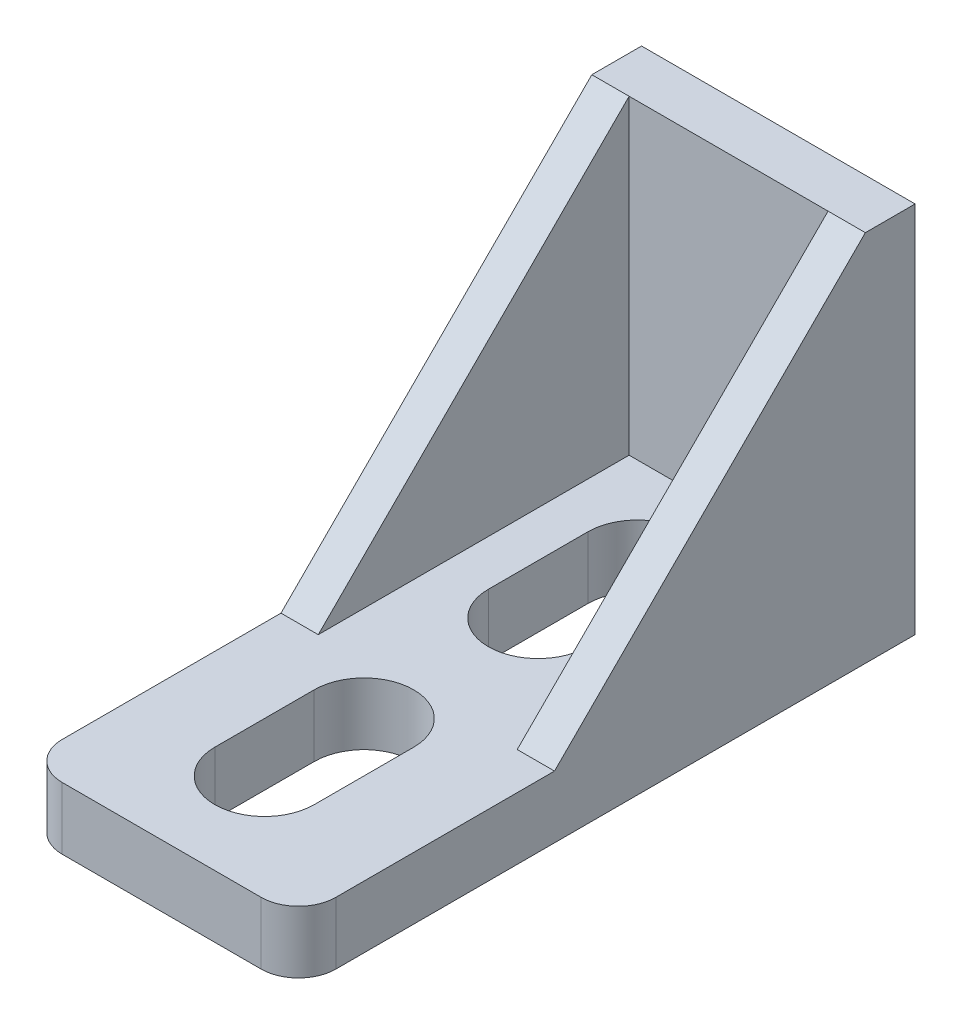
ISO-10303-21;
HEADER;
FILE_DESCRIPTION(('STEP AP214'),'2;1');
FILE_NAME('part.step','',(''),(''),'','','');
FILE_SCHEMA(('AUTOMOTIVE_DESIGN { 1 0 10303 214 1 1 1 1 }'));
ENDSEC;
DATA;
#1=APPLICATION_CONTEXT('core data for automotive mechanical design processes');
#2=APPLICATION_PROTOCOL_DEFINITION('international standard','automotive_design',2000,#1);
#3=PRODUCT_CONTEXT('',#1,'mechanical');
#4=PRODUCT('Part','Part','',(#3));
#5=PRODUCT_RELATED_PRODUCT_CATEGORY('part','',(#4));
#6=PRODUCT_DEFINITION_FORMATION('','',#4);
#7=PRODUCT_DEFINITION_CONTEXT('part definition',#1,'design');
#8=PRODUCT_DEFINITION('design','',#6,#7);
#9=PRODUCT_DEFINITION_SHAPE('','',#8);
#10=(LENGTH_UNIT() NAMED_UNIT(*) SI_UNIT(.MILLI.,.METRE.));
#11=(NAMED_UNIT(*) PLANE_ANGLE_UNIT() SI_UNIT($,.RADIAN.));
#12=(NAMED_UNIT(*) SI_UNIT($,.STERADIAN.) SOLID_ANGLE_UNIT());
#13=UNCERTAINTY_MEASURE_WITH_UNIT(LENGTH_MEASURE(1.E-05),#10,'distance_accuracy_value','');
#14=(GEOMETRIC_REPRESENTATION_CONTEXT(3) GLOBAL_UNCERTAINTY_ASSIGNED_CONTEXT((#13)) GLOBAL_UNIT_ASSIGNED_CONTEXT((#10,
#11,#12)) REPRESENTATION_CONTEXT('',''));
#15=CARTESIAN_POINT('',(0.,0.,0.));
#16=DIRECTION('',(0.,0.,1.));
#17=DIRECTION('',(1.,0.,0.));
#18=AXIS2_PLACEMENT_3D('',#15,#16,#17);
#19=CARTESIAN_POINT('',(-10.7237920302694,30.,-10.2796208530806));
#20=DIRECTION('',(0.,0.,-1.));
#21=DIRECTION('',(-1.,0.,0.));
#22=AXIS2_PLACEMENT_3D('',#19,#20,#21);
#23=PLANE('',#22);
#24=DIRECTION('',(0.,1.,0.));
#25=VECTOR('',#24,1.);
#26=CARTESIAN_POINT('',(8.27620796973059,5.,-10.2796208530806));
#27=LINE('',#26,#25);
#28=CARTESIAN_POINT('',(8.27620796973059,5.,-10.2796208530806));
#29=VERTEX_POINT('',#28);
#30=CARTESIAN_POINT('',(8.27620796973059,30.,-10.2796208530806));
#31=VERTEX_POINT('',#30);
#32=EDGE_CURVE('E173',#29,#31,#27,.T.);
#33=ORIENTED_EDGE('',*,*,#32,.T.);
#34=DIRECTION('',(1.,0.,0.));
#35=VECTOR('',#34,1.);
#36=CARTESIAN_POINT('',(-10.7237920302694,30.,-10.2796208530806));
#37=LINE('',#36,#35);
#38=CARTESIAN_POINT('',(-7.72379203026941,30.,-10.2796208530806));
#39=VERTEX_POINT('',#38);
#40=EDGE_CURVE('E211',#39,#31,#37,.T.);
#41=ORIENTED_EDGE('',*,*,#40,.F.);
#42=DIRECTION('',(0.,1.,0.));
#43=VECTOR('',#42,1.);
#44=CARTESIAN_POINT('',(-7.72379203026941,5.00000000000001,-10.2796208530806));
#45=LINE('',#44,#43);
#46=CARTESIAN_POINT('',(-7.72379203026941,5.,-10.2796208530806));
#47=VERTEX_POINT('',#46);
#48=EDGE_CURVE('E201',#47,#39,#45,.T.);
#49=ORIENTED_EDGE('',*,*,#48,.F.);
#50=DIRECTION('',(1.,0.,0.));
#51=VECTOR('',#50,1.);
#52=CARTESIAN_POINT('',(0.,5.,-10.2796208530806));
#53=LINE('',#52,#51);
#54=EDGE_CURVE('E221',#47,#29,#53,.T.);
#55=ORIENTED_EDGE('',*,*,#54,.T.);
#56=EDGE_LOOP('',(#33,#41,#49,#55));
#57=FACE_BOUND('',#56,.T.);
#58=ADVANCED_FACE('F35',(#57),#23,.F.);
#59=CARTESIAN_POINT('',(0.,5.,0.));
#60=DIRECTION('',(0.,-1.,0.));
#61=DIRECTION('',(0.,0.,-1.));
#62=AXIS2_PLACEMENT_3D('',#59,#60,#61);
#63=PLANE('',#62);
#64=CARTESIAN_POINT('',(-0.048192250806987,5.,4.72037914691943));
#65=DIRECTION('',(0.,1.,0.));
#66=DIRECTION('',(0.,0.,1.));
#67=AXIS2_PLACEMENT_3D('',#64,#65,#66);
#68=CIRCLE('',#67,4.);
#69=CARTESIAN_POINT('',(-4.04819225080699,5.,4.72037914691943));
#70=VERTEX_POINT('',#69);
#71=CARTESIAN_POINT('',(3.95180774919301,5.,4.72037914691943));
#72=VERTEX_POINT('',#71);
#73=EDGE_CURVE('E255',#70,#72,#68,.T.);
#74=ORIENTED_EDGE('',*,*,#73,.F.);
#75=DIRECTION('',(0.,0.,1.));
#76=VECTOR('',#75,1.);
#77=CARTESIAN_POINT('',(-4.04819225080699,5.,4.72037914691943));
#78=LINE('',#77,#76);
#79=CARTESIAN_POINT('',(-4.04819225080699,5.,-3.27962085308057));
#80=VERTEX_POINT('',#79);
#81=EDGE_CURVE('E263',#80,#70,#78,.T.);
#82=ORIENTED_EDGE('',*,*,#81,.F.);
#83=CARTESIAN_POINT('',(-0.0481922508069871,5.,-3.27962085308057));
#84=DIRECTION('',(0.,1.,0.));
#85=DIRECTION('',(0.,0.,-1.));
#86=AXIS2_PLACEMENT_3D('',#83,#84,#85);
#87=CIRCLE('',#86,4.);
#88=CARTESIAN_POINT('',(3.95180774919301,5.,-3.27962085308057));
#89=VERTEX_POINT('',#88);
#90=EDGE_CURVE('E260',#89,#80,#87,.T.);
#91=ORIENTED_EDGE('',*,*,#90,.F.);
#92=DIRECTION('',(0.,0.,-1.));
#93=VECTOR('',#92,1.);
#94=CARTESIAN_POINT('',(3.95180774919301,5.,4.72037914691943));
#95=LINE('',#94,#93);
#96=EDGE_CURVE('E257',#72,#89,#95,.T.);
#97=ORIENTED_EDGE('',*,*,#96,.F.);
#98=EDGE_LOOP('',(#74,#82,#91,#97));
#99=FACE_BOUND('',#98,.T.);
#100=CARTESIAN_POINT('',(-0.048192250806987,5.,26.7203791469194));
#101=DIRECTION('',(0.,1.,0.));
#102=DIRECTION('',(0.,0.,1.));
#103=AXIS2_PLACEMENT_3D('',#100,#101,#102);
#104=CIRCLE('',#103,4.);
#105=CARTESIAN_POINT('',(-4.04819225080699,5.,26.7203791469194));
#106=VERTEX_POINT('',#105);
#107=CARTESIAN_POINT('',(3.95180774919301,5.,26.7203791469194));
#108=VERTEX_POINT('',#107);
#109=EDGE_CURVE('E224',#106,#108,#104,.T.);
#110=ORIENTED_EDGE('',*,*,#109,.F.);
#111=DIRECTION('',(0.,0.,1.));
#112=VECTOR('',#111,1.);
#113=CARTESIAN_POINT('',(-4.04819225080699,5.,26.7203791469194));
#114=LINE('',#113,#112);
#115=CARTESIAN_POINT('',(-4.04819225080699,5.,18.7203791469194));
#116=VERTEX_POINT('',#115);
#117=EDGE_CURVE('E232',#116,#106,#114,.T.);
#118=ORIENTED_EDGE('',*,*,#117,.F.);
#119=CARTESIAN_POINT('',(-0.048192250806987,5.,18.7203791469194));
#120=DIRECTION('',(0.,1.,0.));
#121=DIRECTION('',(0.,0.,-1.));
#122=AXIS2_PLACEMENT_3D('',#119,#120,#121);
#123=CIRCLE('',#122,4.);
#124=CARTESIAN_POINT('',(3.95180774919301,5.,18.7203791469194));
#125=VERTEX_POINT('',#124);
#126=EDGE_CURVE('E229',#125,#116,#123,.T.);
#127=ORIENTED_EDGE('',*,*,#126,.F.);
#128=DIRECTION('',(0.,0.,-1.));
#129=VECTOR('',#128,1.);
#130=CARTESIAN_POINT('',(3.95180774919301,5.,26.7203791469194));
#131=LINE('',#130,#129);
#132=EDGE_CURVE('E226',#108,#125,#131,.T.);
#133=ORIENTED_EDGE('',*,*,#132,.F.);
#134=EDGE_LOOP('',(#110,#118,#127,#133));
#135=FACE_BOUND('',#134,.T.);
#136=DIRECTION('',(1.,0.,0.));
#137=VECTOR('',#136,1.);
#138=CARTESIAN_POINT('',(11.2762079697306,5.,35.3102157116609));
#139=LINE('',#138,#137);
#140=CARTESIAN_POINT('',(-7.72379203026941,5.,35.3102157116609));
#141=VERTEX_POINT('',#140);
#142=CARTESIAN_POINT('',(8.27620796973059,5.,35.3102157116609));
#143=VERTEX_POINT('',#142);
#144=EDGE_CURVE('E288',#141,#143,#139,.T.);
#145=ORIENTED_EDGE('',*,*,#144,.T.);
#146=CARTESIAN_POINT('',(8.27620796973059,5.,32.3102157116609));
#147=DIRECTION('',(0.,-1.,0.));
#148=DIRECTION('',(0.,0.,-1.));
#149=AXIS2_PLACEMENT_3D('',#146,#147,#148);
#150=CIRCLE('',#149,3.);
#151=CARTESIAN_POINT('',(11.2762079697306,5.,32.3102157116609));
#152=VERTEX_POINT('',#151);
#153=EDGE_CURVE('E43',#143,#152,#150,.F.);
#154=ORIENTED_EDGE('',*,*,#153,.T.);
#155=DIRECTION('',(0.,0.,-1.));
#156=VECTOR('',#155,1.);
#157=CARTESIAN_POINT('',(11.2762079697306,5.,-14.2796208530806));
#158=LINE('',#157,#156);
#159=CARTESIAN_POINT('',(11.2762079697306,5.,14.7203791469194));
#160=VERTEX_POINT('',#159);
#161=EDGE_CURVE('E190',#152,#160,#158,.T.);
#162=ORIENTED_EDGE('',*,*,#161,.T.);
#163=DIRECTION('',(1.,0.,0.));
#164=VECTOR('',#163,1.);
#165=CARTESIAN_POINT('',(8.27620796973059,5.,14.7203791469194));
#166=LINE('',#165,#164);
#167=CARTESIAN_POINT('',(8.27620796973059,5.,14.7203791469194));
#168=VERTEX_POINT('',#167);
#169=EDGE_CURVE('E182',#168,#160,#166,.T.);
#170=ORIENTED_EDGE('',*,*,#169,.F.);
#171=DIRECTION('',(0.,0.,-1.));
#172=VECTOR('',#171,1.);
#173=CARTESIAN_POINT('',(8.27620796973059,5.,-14.2796208530806));
#174=LINE('',#173,#172);
#175=EDGE_CURVE('E168',#168,#29,#174,.T.);
#176=ORIENTED_EDGE('',*,*,#175,.T.);
#177=ORIENTED_EDGE('',*,*,#54,.F.);
#178=DIRECTION('',(0.,0.,-1.));
#179=VECTOR('',#178,1.);
#180=CARTESIAN_POINT('',(-7.72379203026941,5.,35.3102157116609));
#181=LINE('',#180,#179);
#182=CARTESIAN_POINT('',(-7.72379203026941,5.,14.7203791469194));
#183=VERTEX_POINT('',#182);
#184=EDGE_CURVE('E199',#183,#47,#181,.T.);
#185=ORIENTED_EDGE('',*,*,#184,.F.);
#186=DIRECTION('',(-1.,0.,0.));
#187=VECTOR('',#186,1.);
#188=CARTESIAN_POINT('',(-7.72379203026941,5.,14.7203791469194));
#189=LINE('',#188,#187);
#190=CARTESIAN_POINT('',(-10.7237920302694,5.,14.7203791469194));
#191=VERTEX_POINT('',#190);
#192=EDGE_CURVE('E204',#183,#191,#189,.T.);
#193=ORIENTED_EDGE('',*,*,#192,.T.);
#194=DIRECTION('',(0.,0.,1.));
#195=VECTOR('',#194,1.);
#196=CARTESIAN_POINT('',(-10.7237920302694,5.,35.3102157116609));
#197=LINE('',#196,#195);
#198=CARTESIAN_POINT('',(-10.7237920302694,5.,32.3102157116609));
#199=VERTEX_POINT('',#198);
#200=EDGE_CURVE('E286',#191,#199,#197,.T.);
#201=ORIENTED_EDGE('',*,*,#200,.T.);
#202=CARTESIAN_POINT('',(-7.72379203026941,5.,32.3102157116609));
#203=DIRECTION('',(0.,-1.,0.));
#204=DIRECTION('',(0.,0.,-1.));
#205=AXIS2_PLACEMENT_3D('',#202,#203,#204);
#206=CIRCLE('',#205,3.);
#207=EDGE_CURVE('E315',#199,#141,#206,.F.);
#208=ORIENTED_EDGE('',*,*,#207,.T.);
#209=EDGE_LOOP('',(#145,#154,#162,#170,#176,#177,#185,#193,#201,#208));
#210=FACE_BOUND('',#209,.T.);
#211=ADVANCED_FACE('F188',(#99,#135,#210),#63,.F.);
#212=CARTESIAN_POINT('',(0.,0.,0.));
#213=DIRECTION('',(0.,-1.,0.));
#214=DIRECTION('',(0.,0.,-1.));
#215=AXIS2_PLACEMENT_3D('',#212,#213,#214);
#216=PLANE('',#215);
#217=DIRECTION('',(0.,0.,-1.));
#218=VECTOR('',#217,1.);
#219=CARTESIAN_POINT('',(11.2762079697306,0.,-14.2796208530806));
#220=LINE('',#219,#218);
#221=CARTESIAN_POINT('',(11.2762079697306,0.,32.3102157116609));
#222=VERTEX_POINT('',#221);
#223=CARTESIAN_POINT('',(11.2762079697306,0.,-14.2796208530806));
#224=VERTEX_POINT('',#223);
#225=EDGE_CURVE('E296',#222,#224,#220,.T.);
#226=ORIENTED_EDGE('',*,*,#225,.F.);
#227=CARTESIAN_POINT('',(8.27620796973059,0.,32.3102157116609));
#228=DIRECTION('',(0.,-1.,0.));
#229=DIRECTION('',(0.,0.,-1.));
#230=AXIS2_PLACEMENT_3D('',#227,#228,#229);
#231=CIRCLE('',#230,3.);
#232=CARTESIAN_POINT('',(8.27620796973059,0.,35.3102157116609));
#233=VERTEX_POINT('',#232);
#234=EDGE_CURVE('E309',#222,#233,#231,.T.);
#235=ORIENTED_EDGE('',*,*,#234,.T.);
#236=DIRECTION('',(1.,0.,0.));
#237=VECTOR('',#236,1.);
#238=CARTESIAN_POINT('',(11.2762079697306,0.,35.3102157116609));
#239=LINE('',#238,#237);
#240=CARTESIAN_POINT('',(-7.72379203026941,0.,35.3102157116609));
#241=VERTEX_POINT('',#240);
#242=EDGE_CURVE('E294',#241,#233,#239,.T.);
#243=ORIENTED_EDGE('',*,*,#242,.F.);
#244=CARTESIAN_POINT('',(-7.72379203026941,0.,32.3102157116609));
#245=DIRECTION('',(0.,-1.,0.));
#246=DIRECTION('',(0.,0.,-1.));
#247=AXIS2_PLACEMENT_3D('',#244,#245,#246);
#248=CIRCLE('',#247,3.);
#249=CARTESIAN_POINT('',(-10.7237920302694,0.,32.3102157116609));
#250=VERTEX_POINT('',#249);
#251=EDGE_CURVE('E307',#241,#250,#248,.T.);
#252=ORIENTED_EDGE('',*,*,#251,.T.);
#253=DIRECTION('',(0.,0.,1.));
#254=VECTOR('',#253,1.);
#255=CARTESIAN_POINT('',(-10.7237920302694,0.,35.3102157116609));
#256=LINE('',#255,#254);
#257=CARTESIAN_POINT('',(-10.7237920302694,0.,-14.2796208530806));
#258=VERTEX_POINT('',#257);
#259=EDGE_CURVE('E285',#258,#250,#256,.T.);
#260=ORIENTED_EDGE('',*,*,#259,.F.);
#261=DIRECTION('',(-1.,0.,0.));
#262=VECTOR('',#261,1.);
#263=CARTESIAN_POINT('',(0.276207969730589,0.,-14.2796208530806));
#264=LINE('',#263,#262);
#265=EDGE_CURVE('E289',#224,#258,#264,.T.);
#266=ORIENTED_EDGE('',*,*,#265,.F.);
#267=EDGE_LOOP('',(#226,#235,#243,#252,#260,#266));
#268=FACE_BOUND('',#267,.T.);
#269=DIRECTION('',(0.,0.,1.));
#270=VECTOR('',#269,1.);
#271=CARTESIAN_POINT('',(-4.04819225080699,0.,4.72037914691943));
#272=LINE('',#271,#270);
#273=CARTESIAN_POINT('',(-4.04819225080699,0.,-3.27962085308057));
#274=VERTEX_POINT('',#273);
#275=CARTESIAN_POINT('',(-4.04819225080699,0.,4.72037914691943));
#276=VERTEX_POINT('',#275);
#277=EDGE_CURVE('E258',#274,#276,#272,.T.);
#278=ORIENTED_EDGE('',*,*,#277,.T.);
#279=CARTESIAN_POINT('',(-0.048192250806987,0.,4.72037914691943));
#280=DIRECTION('',(0.,1.,0.));
#281=DIRECTION('',(0.,0.,1.));
#282=AXIS2_PLACEMENT_3D('',#279,#280,#281);
#283=CIRCLE('',#282,4.);
#284=CARTESIAN_POINT('',(3.95180774919301,0.,4.72037914691943));
#285=VERTEX_POINT('',#284);
#286=EDGE_CURVE('E254',#276,#285,#283,.T.);
#287=ORIENTED_EDGE('',*,*,#286,.T.);
#288=DIRECTION('',(0.,0.,-1.));
#289=VECTOR('',#288,1.);
#290=CARTESIAN_POINT('',(3.95180774919301,0.,4.72037914691943));
#291=LINE('',#290,#289);
#292=CARTESIAN_POINT('',(3.95180774919301,0.,-3.27962085308057));
#293=VERTEX_POINT('',#292);
#294=EDGE_CURVE('E268',#285,#293,#291,.T.);
#295=ORIENTED_EDGE('',*,*,#294,.T.);
#296=CARTESIAN_POINT('',(-0.0481922508069871,0.,-3.27962085308057));
#297=DIRECTION('',(0.,1.,0.));
#298=DIRECTION('',(0.,0.,-1.));
#299=AXIS2_PLACEMENT_3D('',#296,#297,#298);
#300=CIRCLE('',#299,4.);
#301=EDGE_CURVE('E271',#293,#274,#300,.T.);
#302=ORIENTED_EDGE('',*,*,#301,.T.);
#303=EDGE_LOOP('',(#278,#287,#295,#302));
#304=FACE_BOUND('',#303,.T.);
#305=DIRECTION('',(0.,0.,1.));
#306=VECTOR('',#305,1.);
#307=CARTESIAN_POINT('',(-4.04819225080699,0.,26.7203791469194));
#308=LINE('',#307,#306);
#309=CARTESIAN_POINT('',(-4.04819225080699,0.,18.7203791469194));
#310=VERTEX_POINT('',#309);
#311=CARTESIAN_POINT('',(-4.04819225080699,0.,26.7203791469194));
#312=VERTEX_POINT('',#311);
#313=EDGE_CURVE('E227',#310,#312,#308,.T.);
#314=ORIENTED_EDGE('',*,*,#313,.T.);
#315=CARTESIAN_POINT('',(-0.048192250806987,0.,26.7203791469194));
#316=DIRECTION('',(0.,1.,0.));
#317=DIRECTION('',(0.,0.,1.));
#318=AXIS2_PLACEMENT_3D('',#315,#316,#317);
#319=CIRCLE('',#318,4.);
#320=CARTESIAN_POINT('',(3.95180774919301,0.,26.7203791469194));
#321=VERTEX_POINT('',#320);
#322=EDGE_CURVE('E223',#312,#321,#319,.T.);
#323=ORIENTED_EDGE('',*,*,#322,.T.);
#324=DIRECTION('',(0.,0.,-1.));
#325=VECTOR('',#324,1.);
#326=CARTESIAN_POINT('',(3.95180774919301,0.,26.7203791469194));
#327=LINE('',#326,#325);
#328=CARTESIAN_POINT('',(3.95180774919301,0.,18.7203791469194));
#329=VERTEX_POINT('',#328);
#330=EDGE_CURVE('E237',#321,#329,#327,.T.);
#331=ORIENTED_EDGE('',*,*,#330,.T.);
#332=CARTESIAN_POINT('',(-0.048192250806987,0.,18.7203791469194));
#333=DIRECTION('',(0.,1.,0.));
#334=DIRECTION('',(0.,0.,-1.));
#335=AXIS2_PLACEMENT_3D('',#332,#333,#334);
#336=CIRCLE('',#335,4.);
#337=EDGE_CURVE('E240',#329,#310,#336,.T.);
#338=ORIENTED_EDGE('',*,*,#337,.T.);
#339=EDGE_LOOP('',(#314,#323,#331,#338));
#340=FACE_BOUND('',#339,.T.);
#341=ADVANCED_FACE('F326',(#268,#304,#340),#216,.T.);
#342=CARTESIAN_POINT('',(-10.7237920302694,5.,35.3102157116609));
#343=DIRECTION('',(1.,0.,0.));
#344=DIRECTION('',(0.,0.,-1.));
#345=AXIS2_PLACEMENT_3D('',#342,#343,#344);
#346=PLANE('',#345);
#347=ORIENTED_EDGE('',*,*,#259,.T.);
#348=DIRECTION('',(0.,-1.,0.));
#349=VECTOR('',#348,1.);
#350=CARTESIAN_POINT('',(-10.7237920302694,5.,32.3102157116609));
#351=LINE('',#350,#349);
#352=EDGE_CURVE('E11',#250,#199,#351,.F.);
#353=ORIENTED_EDGE('',*,*,#352,.T.);
#354=ORIENTED_EDGE('',*,*,#200,.F.);
#355=DIRECTION('',(0.,-0.707106781186548,0.707106781186547));
#356=VECTOR('',#355,1.);
#357=CARTESIAN_POINT('',(-10.7237920302694,-5.29491828237075,25.0152974292902));
#358=LINE('',#357,#356);
#359=CARTESIAN_POINT('',(-10.7237920302694,30.,-10.2796208530806));
#360=VERTEX_POINT('',#359);
#361=EDGE_CURVE('E192',#360,#191,#358,.T.);
#362=ORIENTED_EDGE('',*,*,#361,.F.);
#363=DIRECTION('',(0.,0.,1.));
#364=VECTOR('',#363,1.);
#365=CARTESIAN_POINT('',(-10.7237920302694,30.,-14.2796208530806));
#366=LINE('',#365,#364);
#367=CARTESIAN_POINT('',(-10.7237920302694,30.,-14.2796208530806));
#368=VERTEX_POINT('',#367);
#369=EDGE_CURVE('E208',#368,#360,#366,.T.);
#370=ORIENTED_EDGE('',*,*,#369,.F.);
#371=DIRECTION('',(0.,-1.,0.));
#372=VECTOR('',#371,1.);
#373=CARTESIAN_POINT('',(-10.7237920302694,5.,-14.2796208530806));
#374=LINE('',#373,#372);
#375=EDGE_CURVE('E301',#368,#258,#374,.T.);
#376=ORIENTED_EDGE('',*,*,#375,.T.);
#377=EDGE_LOOP('',(#347,#353,#354,#362,#370,#376));
#378=FACE_BOUND('',#377,.T.);
#379=ADVANCED_FACE('F334',(#378),#346,.F.);
#380=CARTESIAN_POINT('',(11.2762079697306,5.,35.3102157116609));
#381=DIRECTION('',(0.,0.,-1.));
#382=DIRECTION('',(-1.,0.,0.));
#383=AXIS2_PLACEMENT_3D('',#380,#381,#382);
#384=PLANE('',#383);
#385=ORIENTED_EDGE('',*,*,#242,.T.);
#386=DIRECTION('',(0.,-1.,0.));
#387=VECTOR('',#386,1.);
#388=CARTESIAN_POINT('',(8.27620796973059,5.,35.3102157116609));
#389=LINE('',#388,#387);
#390=EDGE_CURVE('E56',#233,#143,#389,.F.);
#391=ORIENTED_EDGE('',*,*,#390,.T.);
#392=ORIENTED_EDGE('',*,*,#144,.F.);
#393=DIRECTION('',(0.,-1.,0.));
#394=VECTOR('',#393,1.);
#395=CARTESIAN_POINT('',(-7.72379203026941,5.,35.3102157116609));
#396=LINE('',#395,#394);
#397=EDGE_CURVE('E311',#141,#241,#396,.T.);
#398=ORIENTED_EDGE('',*,*,#397,.T.);
#399=EDGE_LOOP('',(#385,#391,#392,#398));
#400=FACE_BOUND('',#399,.T.);
#401=ADVANCED_FACE('F329',(#400),#384,.F.);
#402=CARTESIAN_POINT('',(11.2762079697306,5.,-14.2796208530806));
#403=DIRECTION('',(-1.,0.,0.));
#404=DIRECTION('',(0.,0.,1.));
#405=AXIS2_PLACEMENT_3D('',#402,#403,#404);
#406=PLANE('',#405);
#407=ORIENTED_EDGE('',*,*,#161,.F.);
#408=DIRECTION('',(0.,-1.,0.));
#409=VECTOR('',#408,1.);
#410=CARTESIAN_POINT('',(11.2762079697306,5.,32.3102157116609));
#411=LINE('',#410,#409);
#412=EDGE_CURVE('E304',#152,#222,#411,.T.);
#413=ORIENTED_EDGE('',*,*,#412,.T.);
#414=ORIENTED_EDGE('',*,*,#225,.T.);
#415=DIRECTION('',(0.,-1.,0.));
#416=VECTOR('',#415,1.);
#417=CARTESIAN_POINT('',(11.2762079697306,5.,-14.2796208530806));
#418=LINE('',#417,#416);
#419=CARTESIAN_POINT('',(11.2762079697306,30.,-14.2796208530806));
#420=VERTEX_POINT('',#419);
#421=EDGE_CURVE('E292',#420,#224,#418,.T.);
#422=ORIENTED_EDGE('',*,*,#421,.F.);
#423=DIRECTION('',(0.,0.,-1.));
#424=VECTOR('',#423,1.);
#425=CARTESIAN_POINT('',(11.2762079697306,30.,-14.2796208530806));
#426=LINE('',#425,#424);
#427=CARTESIAN_POINT('',(11.2762079697306,30.,-10.2796208530806));
#428=VERTEX_POINT('',#427);
#429=EDGE_CURVE('E215',#428,#420,#426,.T.);
#430=ORIENTED_EDGE('',*,*,#429,.F.);
#431=DIRECTION('',(0.,-0.707106781186548,0.707106781186548));
#432=VECTOR('',#431,1.);
#433=CARTESIAN_POINT('',(11.2762079697306,19.5,0.220379146919428));
#434=LINE('',#433,#432);
#435=EDGE_CURVE('E186',#428,#160,#434,.T.);
#436=ORIENTED_EDGE('',*,*,#435,.T.);
#437=EDGE_LOOP('',(#407,#413,#414,#422,#430,#436));
#438=FACE_BOUND('',#437,.T.);
#439=ADVANCED_FACE('F320',(#438),#406,.F.);
#440=CARTESIAN_POINT('',(0.276207969730589,5.,-14.2796208530806));
#441=DIRECTION('',(0.,0.,1.));
#442=DIRECTION('',(1.,0.,0.));
#443=AXIS2_PLACEMENT_3D('',#440,#441,#442);
#444=PLANE('',#443);
#445=ORIENTED_EDGE('',*,*,#265,.T.);
#446=ORIENTED_EDGE('',*,*,#375,.F.);
#447=DIRECTION('',(-1.,0.,0.));
#448=VECTOR('',#447,1.);
#449=CARTESIAN_POINT('',(-10.7237920302694,30.,-14.2796208530806));
#450=LINE('',#449,#448);
#451=EDGE_CURVE('E218',#420,#368,#450,.T.);
#452=ORIENTED_EDGE('',*,*,#451,.F.);
#453=ORIENTED_EDGE('',*,*,#421,.T.);
#454=EDGE_LOOP('',(#445,#446,#452,#453));
#455=FACE_BOUND('',#454,.T.);
#456=ADVANCED_FACE('F339',(#455),#444,.F.);
#457=CARTESIAN_POINT('',(-0.048192250806987,5.,4.72037914691943));
#458=DIRECTION('',(0.,-1.,0.));
#459=DIRECTION('',(0.,0.,-1.));
#460=AXIS2_PLACEMENT_3D('',#457,#458,#459);
#461=CYLINDRICAL_SURFACE('',#460,4.);
#462=ORIENTED_EDGE('',*,*,#286,.F.);
#463=DIRECTION('',(0.,-1.,0.));
#464=VECTOR('',#463,1.);
#465=CARTESIAN_POINT('',(-4.04819225080699,5.,4.72037914691943));
#466=LINE('',#465,#464);
#467=EDGE_CURVE('E265',#70,#276,#466,.T.);
#468=ORIENTED_EDGE('',*,*,#467,.F.);
#469=ORIENTED_EDGE('',*,*,#73,.T.);
#470=DIRECTION('',(0.,-1.,0.));
#471=VECTOR('',#470,1.);
#472=CARTESIAN_POINT('',(3.95180774919301,5.,4.72037914691943));
#473=LINE('',#472,#471);
#474=EDGE_CURVE('E282',#72,#285,#473,.T.);
#475=ORIENTED_EDGE('',*,*,#474,.T.);
#476=EDGE_LOOP('',(#462,#468,#469,#475));
#477=FACE_BOUND('',#476,.T.);
#478=ADVANCED_FACE('F395',(#477),#461,.F.);
#479=CARTESIAN_POINT('',(3.95180774919301,5.,4.72037914691943));
#480=DIRECTION('',(-1.,0.,0.));
#481=DIRECTION('',(0.,0.,1.));
#482=AXIS2_PLACEMENT_3D('',#479,#480,#481);
#483=PLANE('',#482);
#484=ORIENTED_EDGE('',*,*,#294,.F.);
#485=ORIENTED_EDGE('',*,*,#474,.F.);
#486=ORIENTED_EDGE('',*,*,#96,.T.);
#487=DIRECTION('',(0.,-1.,0.));
#488=VECTOR('',#487,1.);
#489=CARTESIAN_POINT('',(3.95180774919301,5.,-3.27962085308057));
#490=LINE('',#489,#488);
#491=EDGE_CURVE('E280',#89,#293,#490,.T.);
#492=ORIENTED_EDGE('',*,*,#491,.T.);
#493=EDGE_LOOP('',(#484,#485,#486,#492));
#494=FACE_BOUND('',#493,.T.);
#495=ADVANCED_FACE('F391',(#494),#483,.T.);
#496=CARTESIAN_POINT('',(-0.0481922508069871,5.,-3.27962085308057));
#497=DIRECTION('',(0.,-1.,0.));
#498=DIRECTION('',(0.,0.,-1.));
#499=AXIS2_PLACEMENT_3D('',#496,#497,#498);
#500=CYLINDRICAL_SURFACE('',#499,4.);
#501=ORIENTED_EDGE('',*,*,#301,.F.);
#502=ORIENTED_EDGE('',*,*,#491,.F.);
#503=ORIENTED_EDGE('',*,*,#90,.T.);
#504=DIRECTION('',(0.,-1.,0.));
#505=VECTOR('',#504,1.);
#506=CARTESIAN_POINT('',(-4.04819225080699,5.,-3.27962085308057));
#507=LINE('',#506,#505);
#508=EDGE_CURVE('E278',#80,#274,#507,.T.);
#509=ORIENTED_EDGE('',*,*,#508,.T.);
#510=EDGE_LOOP('',(#501,#502,#503,#509));
#511=FACE_BOUND('',#510,.T.);
#512=ADVANCED_FACE('F387',(#511),#500,.F.);
#513=CARTESIAN_POINT('',(-4.04819225080699,5.,4.72037914691943));
#514=DIRECTION('',(1.,0.,0.));
#515=DIRECTION('',(0.,0.,-1.));
#516=AXIS2_PLACEMENT_3D('',#513,#514,#515);
#517=PLANE('',#516);
#518=ORIENTED_EDGE('',*,*,#277,.F.);
#519=ORIENTED_EDGE('',*,*,#508,.F.);
#520=ORIENTED_EDGE('',*,*,#81,.T.);
#521=ORIENTED_EDGE('',*,*,#467,.T.);
#522=EDGE_LOOP('',(#518,#519,#520,#521));
#523=FACE_BOUND('',#522,.T.);
#524=ADVANCED_FACE('F383',(#523),#517,.T.);
#525=CARTESIAN_POINT('',(-0.048192250806987,5.,26.7203791469194));
#526=DIRECTION('',(0.,-1.,0.));
#527=DIRECTION('',(0.,0.,-1.));
#528=AXIS2_PLACEMENT_3D('',#525,#526,#527);
#529=CYLINDRICAL_SURFACE('',#528,4.);
#530=ORIENTED_EDGE('',*,*,#322,.F.);
#531=DIRECTION('',(0.,-1.,0.));
#532=VECTOR('',#531,1.);
#533=CARTESIAN_POINT('',(-4.04819225080699,5.,26.7203791469194));
#534=LINE('',#533,#532);
#535=EDGE_CURVE('E234',#106,#312,#534,.T.);
#536=ORIENTED_EDGE('',*,*,#535,.F.);
#537=ORIENTED_EDGE('',*,*,#109,.T.);
#538=DIRECTION('',(0.,-1.,0.));
#539=VECTOR('',#538,1.);
#540=CARTESIAN_POINT('',(3.95180774919301,5.,26.7203791469194));
#541=LINE('',#540,#539);
#542=EDGE_CURVE('E251',#108,#321,#541,.T.);
#543=ORIENTED_EDGE('',*,*,#542,.T.);
#544=EDGE_LOOP('',(#530,#536,#537,#543));
#545=FACE_BOUND('',#544,.T.);
#546=ADVANCED_FACE('F379',(#545),#529,.F.);
#547=CARTESIAN_POINT('',(3.95180774919301,5.,26.7203791469194));
#548=DIRECTION('',(-1.,0.,0.));
#549=DIRECTION('',(0.,0.,1.));
#550=AXIS2_PLACEMENT_3D('',#547,#548,#549);
#551=PLANE('',#550);
#552=ORIENTED_EDGE('',*,*,#330,.F.);
#553=ORIENTED_EDGE('',*,*,#542,.F.);
#554=ORIENTED_EDGE('',*,*,#132,.T.);
#555=DIRECTION('',(0.,-1.,0.));
#556=VECTOR('',#555,1.);
#557=CARTESIAN_POINT('',(3.95180774919301,5.,18.7203791469194));
#558=LINE('',#557,#556);
#559=EDGE_CURVE('E249',#125,#329,#558,.T.);
#560=ORIENTED_EDGE('',*,*,#559,.T.);
#561=EDGE_LOOP('',(#552,#553,#554,#560));
#562=FACE_BOUND('',#561,.T.);
#563=ADVANCED_FACE('F375',(#562),#551,.T.);
#564=CARTESIAN_POINT('',(-0.048192250806987,5.,18.7203791469194));
#565=DIRECTION('',(0.,-1.,0.));
#566=DIRECTION('',(0.,0.,-1.));
#567=AXIS2_PLACEMENT_3D('',#564,#565,#566);
#568=CYLINDRICAL_SURFACE('',#567,4.);
#569=ORIENTED_EDGE('',*,*,#337,.F.);
#570=ORIENTED_EDGE('',*,*,#559,.F.);
#571=ORIENTED_EDGE('',*,*,#126,.T.);
#572=DIRECTION('',(0.,-1.,0.));
#573=VECTOR('',#572,1.);
#574=CARTESIAN_POINT('',(-4.04819225080699,5.,18.7203791469194));
#575=LINE('',#574,#573);
#576=EDGE_CURVE('E247',#116,#310,#575,.T.);
#577=ORIENTED_EDGE('',*,*,#576,.T.);
#578=EDGE_LOOP('',(#569,#570,#571,#577));
#579=FACE_BOUND('',#578,.T.);
#580=ADVANCED_FACE('F371',(#579),#568,.F.);
#581=CARTESIAN_POINT('',(-4.04819225080699,5.,26.7203791469194));
#582=DIRECTION('',(1.,0.,0.));
#583=DIRECTION('',(0.,0.,-1.));
#584=AXIS2_PLACEMENT_3D('',#581,#582,#583);
#585=PLANE('',#584);
#586=ORIENTED_EDGE('',*,*,#313,.F.);
#587=ORIENTED_EDGE('',*,*,#576,.F.);
#588=ORIENTED_EDGE('',*,*,#117,.T.);
#589=ORIENTED_EDGE('',*,*,#535,.T.);
#590=EDGE_LOOP('',(#586,#587,#588,#589));
#591=FACE_BOUND('',#590,.T.);
#592=ADVANCED_FACE('F359',(#591),#585,.T.);
#593=CARTESIAN_POINT('',(0.,30.,0.));
#594=DIRECTION('',(0.,1.,0.));
#595=DIRECTION('',(0.,0.,1.));
#596=AXIS2_PLACEMENT_3D('',#593,#594,#595);
#597=PLANE('',#596);
#598=ORIENTED_EDGE('',*,*,#369,.T.);
#599=EDGE_CURVE('E212',#360,#39,#37,.T.);
#600=ORIENTED_EDGE('',*,*,#599,.T.);
#601=ORIENTED_EDGE('',*,*,#40,.T.);
#602=DIRECTION('',(1.,0.,0.));
#603=VECTOR('',#602,1.);
#604=CARTESIAN_POINT('',(8.27620796973059,30.,-10.2796208530806));
#605=LINE('',#604,#603);
#606=EDGE_CURVE('E185',#31,#428,#605,.T.);
#607=ORIENTED_EDGE('',*,*,#606,.T.);
#608=ORIENTED_EDGE('',*,*,#429,.T.);
#609=ORIENTED_EDGE('',*,*,#451,.T.);
#610=EDGE_LOOP('',(#598,#600,#601,#607,#608,#609));
#611=FACE_BOUND('',#610,.T.);
#612=ADVANCED_FACE('F341',(#611),#597,.T.);
#613=CARTESIAN_POINT('',(-7.72379203026941,-5.29491828237075,25.0152974292902));
#614=DIRECTION('',(0.,-0.707106781186547,-0.707106781186548));
#615=DIRECTION('',(0.,0.707106781186548,-0.707106781186547));
#616=AXIS2_PLACEMENT_3D('',#613,#614,#615);
#617=PLANE('',#616);
#618=ORIENTED_EDGE('',*,*,#361,.T.);
#619=ORIENTED_EDGE('',*,*,#192,.F.);
#620=DIRECTION('',(0.,-0.707106781186548,0.707106781186547));
#621=VECTOR('',#620,1.);
#622=CARTESIAN_POINT('',(-7.72379203026941,-5.29491828237075,25.0152974292902));
#623=LINE('',#622,#621);
#624=EDGE_CURVE('E197',#39,#183,#623,.T.);
#625=ORIENTED_EDGE('',*,*,#624,.F.);
#626=ORIENTED_EDGE('',*,*,#599,.F.);
#627=EDGE_LOOP('',(#618,#619,#625,#626));
#628=FACE_BOUND('',#627,.T.);
#629=ADVANCED_FACE('F351',(#628),#617,.F.);
#630=CARTESIAN_POINT('',(-7.72379203026941,0.,0.));
#631=DIRECTION('',(1.,0.,0.));
#632=DIRECTION('',(0.,0.,-1.));
#633=AXIS2_PLACEMENT_3D('',#630,#631,#632);
#634=PLANE('',#633);
#635=ORIENTED_EDGE('',*,*,#624,.T.);
#636=ORIENTED_EDGE('',*,*,#184,.T.);
#637=ORIENTED_EDGE('',*,*,#48,.T.);
#638=EDGE_LOOP('',(#635,#636,#637));
#639=FACE_BOUND('',#638,.T.);
#640=ADVANCED_FACE('F349',(#639),#634,.T.);
#641=CARTESIAN_POINT('',(8.27620796973059,19.5,0.220379146919428));
#642=DIRECTION('',(0.,0.707106781186547,0.707106781186547));
#643=DIRECTION('',(0.,-0.707106781186548,0.707106781186548));
#644=AXIS2_PLACEMENT_3D('',#641,#642,#643);
#645=PLANE('',#644);
#646=ORIENTED_EDGE('',*,*,#435,.F.);
#647=ORIENTED_EDGE('',*,*,#606,.F.);
#648=DIRECTION('',(0.,-0.707106781186548,0.707106781186548));
#649=VECTOR('',#648,1.);
#650=CARTESIAN_POINT('',(8.27620796973059,19.5,0.220379146919428));
#651=LINE('',#650,#649);
#652=EDGE_CURVE('E171',#31,#168,#651,.T.);
#653=ORIENTED_EDGE('',*,*,#652,.T.);
#654=ORIENTED_EDGE('',*,*,#169,.T.);
#655=EDGE_LOOP('',(#646,#647,#653,#654));
#656=FACE_BOUND('',#655,.T.);
#657=ADVANCED_FACE('F181',(#656),#645,.T.);
#658=CARTESIAN_POINT('',(8.27620796973059,0.,0.));
#659=DIRECTION('',(1.,0.,0.));
#660=DIRECTION('',(0.,0.,-1.));
#661=AXIS2_PLACEMENT_3D('',#658,#659,#660);
#662=PLANE('',#661);
#663=ORIENTED_EDGE('',*,*,#652,.F.);
#664=ORIENTED_EDGE('',*,*,#32,.F.);
#665=ORIENTED_EDGE('',*,*,#175,.F.);
#666=EDGE_LOOP('',(#663,#664,#665));
#667=FACE_BOUND('',#666,.T.);
#668=ADVANCED_FACE('F170',(#667),#662,.F.);
#669=CARTESIAN_POINT('',(8.27620796973059,5.,32.3102157116609));
#670=DIRECTION('',(0.,-1.,0.));
#671=DIRECTION('',(0.,0.,-1.));
#672=AXIS2_PLACEMENT_3D('',#669,#670,#671);
#673=CYLINDRICAL_SURFACE('',#672,3.);
#674=ORIENTED_EDGE('',*,*,#153,.F.);
#675=ORIENTED_EDGE('',*,*,#390,.F.);
#676=ORIENTED_EDGE('',*,*,#234,.F.);
#677=ORIENTED_EDGE('',*,*,#412,.F.);
#678=EDGE_LOOP('',(#674,#675,#676,#677));
#679=FACE_BOUND('',#678,.T.);
#680=ADVANCED_FACE('F323',(#679),#673,.T.);
#681=CARTESIAN_POINT('',(-7.72379203026941,5.,32.3102157116609));
#682=DIRECTION('',(0.,-1.,0.));
#683=DIRECTION('',(0.,0.,-1.));
#684=AXIS2_PLACEMENT_3D('',#681,#682,#683);
#685=CYLINDRICAL_SURFACE('',#684,3.);
#686=ORIENTED_EDGE('',*,*,#207,.F.);
#687=ORIENTED_EDGE('',*,*,#352,.F.);
#688=ORIENTED_EDGE('',*,*,#251,.F.);
#689=ORIENTED_EDGE('',*,*,#397,.F.);
#690=EDGE_LOOP('',(#686,#687,#688,#689));
#691=FACE_BOUND('',#690,.T.);
#692=ADVANCED_FACE('F37',(#691),#685,.T.);
#693=CLOSED_SHELL('',(#58,#211,#341,#379,#401,#439,#456,#478,#495,#512,#524,#546,#563,#580,#592,
#612,#629,#640,#657,#668,#680,#692));
#694=MANIFOLD_SOLID_BREP('B2',#693);
#695=ADVANCED_BREP_SHAPE_REPRESENTATION('',(#18,#694),#14);
#696=SHAPE_DEFINITION_REPRESENTATION(#9,#695);
ENDSEC;
END-ISO-10303-21;
